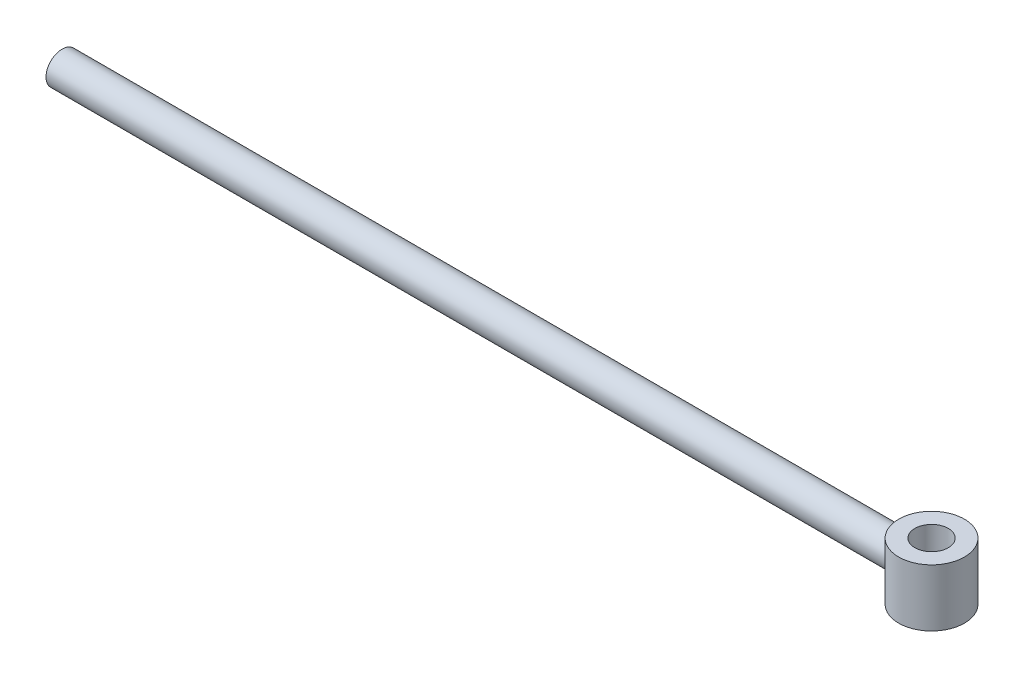
ISO-10303-21;
HEADER;
FILE_DESCRIPTION(('STEP AP214'),'2;1');
FILE_NAME('part.step','',(''),(''),'','','');
FILE_SCHEMA(('AUTOMOTIVE_DESIGN { 1 0 10303 214 1 1 1 1 }'));
ENDSEC;
DATA;
#1=APPLICATION_CONTEXT('core data for automotive mechanical design processes');
#2=APPLICATION_PROTOCOL_DEFINITION('international standard','automotive_design',2000,#1);
#3=PRODUCT_CONTEXT('',#1,'mechanical');
#4=PRODUCT('Part','Part','',(#3));
#5=PRODUCT_RELATED_PRODUCT_CATEGORY('part','',(#4));
#6=PRODUCT_DEFINITION_FORMATION('','',#4);
#7=PRODUCT_DEFINITION_CONTEXT('part definition',#1,'design');
#8=PRODUCT_DEFINITION('design','',#6,#7);
#9=PRODUCT_DEFINITION_SHAPE('','',#8);
#10=(LENGTH_UNIT() NAMED_UNIT(*) SI_UNIT(.MILLI.,.METRE.));
#11=(NAMED_UNIT(*) PLANE_ANGLE_UNIT() SI_UNIT($,.RADIAN.));
#12=(NAMED_UNIT(*) SI_UNIT($,.STERADIAN.) SOLID_ANGLE_UNIT());
#13=UNCERTAINTY_MEASURE_WITH_UNIT(LENGTH_MEASURE(1.E-05),#10,'distance_accuracy_value','');
#14=(GEOMETRIC_REPRESENTATION_CONTEXT(3) GLOBAL_UNCERTAINTY_ASSIGNED_CONTEXT((#13)) GLOBAL_UNIT_ASSIGNED_CONTEXT((#10,
#11,#12)) REPRESENTATION_CONTEXT('',''));
#15=CARTESIAN_POINT('',(0.,0.,0.));
#16=DIRECTION('',(0.,0.,1.));
#17=DIRECTION('',(1.,0.,0.));
#18=AXIS2_PLACEMENT_3D('',#15,#16,#17);
#19=CARTESIAN_POINT('',(38.1,60.96,-126.746));
#20=DIRECTION('',(0.,-1.,0.));
#21=DIRECTION('',(0.,0.,-1.));
#22=AXIS2_PLACEMENT_3D('',#19,#20,#21);
#23=PLANE('',#22);
#24=CARTESIAN_POINT('',(38.1,60.96,-139.7));
#25=DIRECTION('',(0.,1.,0.));
#26=DIRECTION('',(0.,0.,1.));
#27=AXIS2_PLACEMENT_3D('',#24,#25,#26);
#28=CIRCLE('',#27,6.604);
#29=CARTESIAN_POINT('',(38.1,60.96,-133.096));
#30=VERTEX_POINT('',#29);
#31=EDGE_CURVE('E10',#30,#30,#28,.T.);
#32=ORIENTED_EDGE('',*,*,#31,.F.);
#33=EDGE_LOOP('',(#32));
#34=FACE_BOUND('',#33,.T.);
#35=CARTESIAN_POINT('',(38.1,60.96,-139.7));
#36=DIRECTION('',(0.,1.,0.));
#37=DIRECTION('',(0.,0.,1.));
#38=AXIS2_PLACEMENT_3D('',#35,#36,#37);
#39=CIRCLE('',#38,12.954);
#40=CARTESIAN_POINT('',(38.1,60.96,-126.746));
#41=VERTEX_POINT('',#40);
#42=EDGE_CURVE('E45',#41,#41,#39,.T.);
#43=ORIENTED_EDGE('',*,*,#42,.T.);
#44=EDGE_LOOP('',(#43));
#45=FACE_BOUND('',#44,.T.);
#46=ADVANCED_FACE('F31',(#34,#45),#23,.F.);
#47=CARTESIAN_POINT('',(38.1,50.8,-139.7));
#48=DIRECTION('',(0.,1.,0.));
#49=DIRECTION('',(0.,0.,1.));
#50=AXIS2_PLACEMENT_3D('',#47,#48,#49);
#51=CYLINDRICAL_SURFACE('',#50,6.604);
#52=CARTESIAN_POINT('',(38.1,38.354,-139.7));
#53=DIRECTION('',(0.,1.,0.));
#54=DIRECTION('',(0.,0.,1.));
#55=AXIS2_PLACEMENT_3D('',#52,#53,#54);
#56=CIRCLE('',#55,6.604);
#57=CARTESIAN_POINT('',(38.1,38.354,-133.096));
#58=VERTEX_POINT('',#57);
#59=EDGE_CURVE('E37',#58,#58,#56,.T.);
#60=ORIENTED_EDGE('',*,*,#59,.F.);
#61=EDGE_LOOP('',(#60));
#62=FACE_BOUND('',#61,.T.);
#63=ORIENTED_EDGE('',*,*,#31,.T.);
#64=EDGE_LOOP('',(#63));
#65=FACE_BOUND('',#64,.T.);
#66=ADVANCED_FACE('F74',(#62,#65),#51,.F.);
#67=CARTESIAN_POINT('',(38.1,38.354,-126.746));
#68=DIRECTION('',(0.,1.,0.));
#69=DIRECTION('',(0.,0.,1.));
#70=AXIS2_PLACEMENT_3D('',#67,#68,#69);
#71=PLANE('',#70);
#72=CARTESIAN_POINT('',(38.1,38.354,-139.7));
#73=DIRECTION('',(0.,1.,0.));
#74=DIRECTION('',(0.,0.,1.));
#75=AXIS2_PLACEMENT_3D('',#72,#73,#74);
#76=CIRCLE('',#75,12.954);
#77=CARTESIAN_POINT('',(38.1,38.354,-126.746));
#78=VERTEX_POINT('',#77);
#79=EDGE_CURVE('E41',#78,#78,#76,.T.);
#80=ORIENTED_EDGE('',*,*,#79,.F.);
#81=EDGE_LOOP('',(#80));
#82=FACE_BOUND('',#81,.T.);
#83=ORIENTED_EDGE('',*,*,#59,.T.);
#84=EDGE_LOOP('',(#83));
#85=FACE_BOUND('',#84,.T.);
#86=ADVANCED_FACE('F79',(#82,#85),#71,.F.);
#87=CARTESIAN_POINT('',(38.1,50.8,-139.7));
#88=DIRECTION('',(0.,1.,0.));
#89=DIRECTION('',(0.,0.,1.));
#90=AXIS2_PLACEMENT_3D('',#87,#88,#89);
#91=CYLINDRICAL_SURFACE('',#90,12.954);
#92=CARTESIAN_POINT('',(26.8091357283864,50.165,-133.35));
#93=CARTESIAN_POINT('',(26.8091345194287,50.3310209709402,-133.350000943041));
#94=CARTESIAN_POINT('',(26.8054613740518,50.4970623056905,-133.356519782259));
#95=CARTESIAN_POINT('',(26.7909025321912,50.8278752109819,-133.382512665754));
#96=CARTESIAN_POINT('',(26.7800133015269,50.9926461192907,-133.401993058156));
#97=CARTESIAN_POINT('',(26.7514015930104,51.3198489655883,-133.453696944491));
#98=CARTESIAN_POINT('',(26.7336678897072,51.4822766040664,-133.485941374648));
#99=CARTESIAN_POINT('',(26.6919901669799,51.8034275344849,-133.562790955329));
#100=CARTESIAN_POINT('',(26.6680434598922,51.9621491907973,-133.607401455825));
#101=CARTESIAN_POINT('',(26.6148879861214,52.2739444918484,-133.708210555407));
#102=CARTESIAN_POINT('',(26.5857096439459,52.4270449318691,-133.764342411892));
#103=CARTESIAN_POINT('',(26.5228872978798,52.7277277276391,-133.887825072779));
#104=CARTESIAN_POINT('',(26.4892415703833,52.8753079252585,-133.955180209915));
#105=CARTESIAN_POINT('',(26.3830404234559,53.3085298750814,-134.173238421303));
#106=CARTESIAN_POINT('',(26.3051656681572,53.5849596242103,-134.340034476213));
#107=CARTESIAN_POINT('',(26.1365952187344,54.1287985128525,-134.726970185676));
#108=CARTESIAN_POINT('',(26.0453726322713,54.3937641716475,-134.950285902964));
#109=CARTESIAN_POINT('',(25.8645893505226,54.884502859345,-135.437582442392));
#110=CARTESIAN_POINT('',(25.7750294757531,55.1102569743632,-135.70158277373));
#111=CARTESIAN_POINT('',(25.6457891462847,55.4217486115604,-136.133016920814));
#112=CARTESIAN_POINT('',(25.6023564662654,55.523619587631,-136.287929806022));
#113=CARTESIAN_POINT('',(25.5196279516889,55.7138274796052,-136.606872386624));
#114=CARTESIAN_POINT('',(25.4803303632018,55.8021701409432,-136.770898171237));
#115=CARTESIAN_POINT('',(25.4070064920368,55.964457485692,-137.107005438899));
#116=CARTESIAN_POINT('',(25.3729790086762,56.0384054496212,-137.279085075379));
#117=CARTESIAN_POINT('',(25.3112012631133,56.1710975871901,-137.630101234286));
#118=CARTESIAN_POINT('',(25.2834503642544,56.2298433029357,-137.80903705911));
#119=CARTESIAN_POINT('',(25.2367553597481,56.3278866539171,-138.159813292571));
#120=CARTESIAN_POINT('',(25.217336602919,56.3682444779326,-138.331294528795));
#121=CARTESIAN_POINT('',(25.1852364970418,56.4346369318549,-138.677632628746));
#122=CARTESIAN_POINT('',(25.1725548645949,56.4606721642467,-138.852489350162));
#123=CARTESIAN_POINT('',(25.1543012648384,56.4980692509802,-139.204048600796));
#124=CARTESIAN_POINT('',(25.1487258309292,56.5094382599431,-139.38075018759));
#125=CARTESIAN_POINT('',(25.1448383607322,56.5173704844369,-139.734561018763));
#126=CARTESIAN_POINT('',(25.1465259024699,56.5139345601257,-139.911670238862));
#127=CARTESIAN_POINT('',(25.1566662708345,56.4932178504099,-140.249924074625));
#128=CARTESIAN_POINT('',(25.1645391316963,56.4771238159194,-140.4111604753));
#129=CARTESIAN_POINT('',(25.1861428946757,56.4327321332615,-140.731602933701));
#130=CARTESIAN_POINT('',(25.1998757864852,56.4044303400844,-140.890808282884));
#131=CARTESIAN_POINT('',(25.2328634550828,56.3359388320205,-141.205992973492));
#132=CARTESIAN_POINT('',(25.2521163247273,56.295753222823,-141.361973409197));
#133=CARTESIAN_POINT('',(25.2957021679788,56.2038791496866,-141.669837148275));
#134=CARTESIAN_POINT('',(25.3200370856554,56.1521862833,-141.821718858555));
#135=CARTESIAN_POINT('',(25.3736028512173,56.036984859735,-142.122515342152));
#136=CARTESIAN_POINT('',(25.4028966136967,55.9733231270601,-142.271360272638));
#137=CARTESIAN_POINT('',(25.4654814148901,55.835204988301,-142.563103116503));
#138=CARTESIAN_POINT('',(25.4987738992041,55.7607446763331,-142.705998853865));
#139=CARTESIAN_POINT('',(25.6035836718327,55.5219892562854,-143.124651908484));
#140=CARTESIAN_POINT('',(25.6800670252792,55.3422493657298,-143.390557089867));
#141=CARTESIAN_POINT('',(25.8472078263352,54.9280315861419,-143.913980204731));
#142=CARTESIAN_POINT('',(25.9385219088885,54.6900440008963,-144.168488764982));
#143=CARTESIAN_POINT('',(26.1205221013451,54.1752528247017,-144.635696893873));
#144=CARTESIAN_POINT('',(26.2112077158873,53.8984216182819,-144.848366456847));
#145=CARTESIAN_POINT('',(26.3420011019447,53.4496702802442,-145.137621463951));
#146=CARTESIAN_POINT('',(26.3858570732415,53.2895533322911,-145.231204425549));
#147=CARTESIAN_POINT('',(26.4692091613899,52.9608747376694,-145.404387748741));
#148=CARTESIAN_POINT('',(26.5087072382998,52.7923169374642,-145.483994406088));
#149=CARTESIAN_POINT('',(26.581892334402,52.4478688087468,-145.628395441464));
#150=CARTESIAN_POINT('',(26.6155826446418,52.2719827035493,-145.693198215125));
#151=CARTESIAN_POINT('',(26.675828450953,51.9140491418427,-145.807257082587));
#152=CARTESIAN_POINT('',(26.7023848795416,51.7320024941256,-145.856515208479));
#153=CARTESIAN_POINT('',(26.7454528186302,51.3776789569149,-145.935562421708));
#154=CARTESIAN_POINT('',(26.7625869321303,51.2057497121969,-145.966571742859));
#155=CARTESIAN_POINT('',(26.7891247961361,50.859328855553,-146.014346441624));
#156=CARTESIAN_POINT('',(26.7985289723583,50.6848373852772,-146.031112603663));
#157=CARTESIAN_POINT('',(26.80921085286,50.3349131592709,-146.05014302005));
#158=CARTESIAN_POINT('',(26.8104930493164,50.1594809775879,-146.052415290813));
#159=CARTESIAN_POINT('',(26.8048874312566,49.809167640272,-146.042442927349));
#160=CARTESIAN_POINT('',(26.7980001187757,49.6342864514415,-146.030199185165));
#161=CARTESIAN_POINT('',(26.7774722609599,49.3046336739581,-145.993398638389));
#162=CARTESIAN_POINT('',(26.7646044036311,49.1496540139324,-145.970247302639));
#163=CARTESIAN_POINT('',(26.7329587232138,48.8423605342224,-145.912694018571));
#164=CARTESIAN_POINT('',(26.7141789348035,48.6900476188525,-145.878288328783));
#165=CARTESIAN_POINT('',(26.6712963995991,48.3890953193555,-145.79859761045));
#166=CARTESIAN_POINT('',(26.6471944124057,48.2404554143675,-145.753314134335));
#167=CARTESIAN_POINT('',(26.5943564655263,47.9475737870794,-145.652271145477));
#168=CARTESIAN_POINT('',(26.5656187016505,47.8033338032719,-145.596507552595));
#169=CARTESIAN_POINT('',(26.5028742372998,47.5134640825603,-145.472162234246));
#170=CARTESIAN_POINT('',(26.4686859069385,47.3680759363509,-145.403108671536));
#171=CARTESIAN_POINT('',(26.3970138147125,47.0835649822582,-145.254550699828));
#172=CARTESIAN_POINT('',(26.3595289448654,46.9444443048425,-145.17504277259));
#173=CARTESIAN_POINT('',(26.2435409318805,46.5373786965788,-144.921590990735));
#174=CARTESIAN_POINT('',(26.1614775749279,46.2796121837325,-144.732668144432));
#175=CARTESIAN_POINT('',(25.9853086574986,45.7664631386068,-144.293756133767));
#176=CARTESIAN_POINT('',(25.8909412574546,45.5150912027726,-144.039156406326));
#177=CARTESIAN_POINT('',(25.7548646273288,45.1720316719533,-143.627440095094));
#178=CARTESIAN_POINT('',(25.7103891363287,45.0632811053582,-143.485122483034));
#179=CARTESIAN_POINT('',(25.6243895110163,44.8578395645913,-143.191224892051));
#180=CARTESIAN_POINT('',(25.5828641221261,44.7611434507064,-143.039648902024));
#181=CARTESIAN_POINT('',(25.5029361769318,44.5784713794439,-142.724426174196));
#182=CARTESIAN_POINT('',(25.4646284121339,44.4927961488066,-142.560580988121));
#183=CARTESIAN_POINT('',(25.3933427957471,44.3357274547047,-142.225144656105));
#184=CARTESIAN_POINT('',(25.3603625934758,44.2643276891474,-142.05355696938));
#185=CARTESIAN_POINT('',(25.3007021880871,44.1366007615901,-141.703879432793));
#186=CARTESIAN_POINT('',(25.2740191332753,44.0802667754313,-141.525792568468));
#187=CARTESIAN_POINT('',(25.2277602796869,43.983353263923,-141.164484420422));
#188=CARTESIAN_POINT('',(25.2081836783518,43.9427719595284,-140.981263719005));
#189=CARTESIAN_POINT('',(25.1781671656492,43.8808286326666,-140.627866141491));
#190=CARTESIAN_POINT('',(25.1670665827257,43.8580720787909,-140.45798861488));
#191=CARTESIAN_POINT('',(25.1515754853437,43.8263664706336,-140.116649882967));
#192=CARTESIAN_POINT('',(25.1471844857083,43.817416417989,-139.945188793075));
#193=CARTESIAN_POINT('',(25.1452342734918,43.8134378726006,-139.602114473153));
#194=CARTESIAN_POINT('',(25.1476732087432,43.8184056055792,-139.430501296984));
#195=CARTESIAN_POINT('',(25.1593112148401,43.8421906341595,-139.088471825116));
#196=CARTESIAN_POINT('',(25.1685101226314,43.8610075957102,-138.918055500649));
#197=CARTESIAN_POINT('',(25.192640184115,43.9106608295217,-138.590273313457));
#198=CARTESIAN_POINT('',(25.20718035921,43.9406791153059,-138.432753659823));
#199=CARTESIAN_POINT('',(25.2416444331066,44.0123842452525,-138.120943575924));
#200=CARTESIAN_POINT('',(25.261570052748,44.0540748192766,-137.966654194853));
#201=CARTESIAN_POINT('',(25.3063396556938,44.1487000771422,-137.662349744295));
#202=CARTESIAN_POINT('',(25.3311822999179,44.2016316999331,-137.512333523771));
#203=CARTESIAN_POINT('',(25.3852480339007,44.3182938324656,-137.217319478696));
#204=CARTESIAN_POINT('',(25.4144727986362,44.3820284726622,-137.072323599268));
#205=CARTESIAN_POINT('',(25.4780254618274,44.5227718557627,-136.781970070348));
#206=CARTESIAN_POINT('',(25.5125197213309,44.6002364405129,-136.636869503088));
#207=CARTESIAN_POINT('',(25.5848198318292,44.7657726116658,-136.353691947468));
#208=CARTESIAN_POINT('',(25.6226269017162,44.853848106679,-136.215617574064));
#209=CARTESIAN_POINT('',(25.7397955945507,45.1331351951527,-135.812913623685));
#210=CARTESIAN_POINT('',(25.8229380625024,45.339478904376,-135.559656660722));
#211=CARTESIAN_POINT('',(26.0002516971347,45.8092998533766,-135.065595949822));
#212=CARTESIAN_POINT('',(26.0947151766211,46.0763609620989,-134.828324216839));
#213=CARTESIAN_POINT('',(26.2772656401137,46.6483754834759,-134.400640147173));
#214=CARTESIAN_POINT('',(26.3653473078994,46.953359925732,-134.210266568179));
#215=CARTESIAN_POINT('',(26.4856346773667,47.4382194377993,-133.962283142037));
#216=CARTESIAN_POINT('',(26.5241788777058,47.6067885228694,-133.885137901634));
#217=CARTESIAN_POINT('',(26.5953590395799,47.9510771542138,-133.74554886185));
#218=CARTESIAN_POINT('',(26.627998034677,48.1267929719912,-133.683097509092));
#219=CARTESIAN_POINT('',(26.6859920530288,48.4836659419219,-133.573796863664));
#220=CARTESIAN_POINT('',(26.7113658976816,48.6648076660798,-133.526907205097));
#221=CARTESIAN_POINT('',(26.7538261044452,49.0313679770893,-133.4492057497));
#222=CARTESIAN_POINT('',(26.7709183398695,49.2167834349604,-133.418382557361));
#223=CARTESIAN_POINT('',(26.7919726404298,49.5295952690992,-133.38059182936));
#224=CARTESIAN_POINT('',(26.7983953164893,49.6563040903898,-133.369129414016));
#225=CARTESIAN_POINT('',(26.8069774589374,49.910337922273,-133.353832896412));
#226=CARTESIAN_POINT('',(26.8091366556493,50.0376629713331,-133.349999276693));
#227=CARTESIAN_POINT('',(26.8091357283864,50.165,-133.35));
#228=B_SPLINE_CURVE_WITH_KNOTS('',3,(#92,#93,#94,#95,#96,#97,#98,#99,#100,#101,#102,#103,#104,
#105,#106,#107,#108,#109,#110,#111,#112,#113,#114,#115,#116,#117,#118,#119,#120,#121,#122,#123,
#124,#125,#126,#127,#128,#129,#130,#131,#132,#133,#134,#135,#136,#137,#138,#139,#140,#141,#142,
#143,#144,#145,#146,#147,#148,#149,#150,#151,#152,#153,#154,#155,#156,#157,#158,#159,#160,#161,
#162,#163,#164,#165,#166,#167,#168,#169,#170,#171,#172,#173,#174,#175,#176,#177,#178,#179,#180,
#181,#182,#183,#184,#185,#186,#187,#188,#189,#190,#191,#192,#193,#194,#195,#196,#197,#198,#199,
#200,#201,#202,#203,#204,#205,#206,#207,#208,#209,#210,#211,#212,#213,#214,#215,#216,#217,#218,
#219,#220,#221,#222,#223,#224,#225,#226,#227),.UNSPECIFIED.,.T.,.F.,(4,2,2,2,2,2,2,2,2,2,2,2,2,
2,2,2,2,2,2,2,2,2,2,2,2,2,2,2,2,2,2,2,2,2,2,2,2,2,2,2,2,2,2,2,2,2,2,2,2,2,2,2,2,2,2,2,2,2,2,2,2,
2,2,2,2,2,2,4),(0.,0.497931272415873,0.996106594185176,1.49510245697003,1.99431453975243,
2.49071244196593,2.98730242388816,3.97951131388685,5.05021111333792,6.12142594454064,
6.69208421127271,7.2624994449807,7.83278452978109,8.40301174254048,8.93399577340326,
9.46495746651881,9.99566004261537,10.5263317856222,11.0124440762123,11.4987215509524,
11.9848312196324,12.4711271848038,12.9641323189184,13.4573162215208,14.4430963706711,
15.5193466155994,16.5963659232802,17.1674680049523,17.7383121647597,18.3088317772248,
18.8792767769456,19.40516240316,19.9310190649564,20.45658485586,20.9821183512004,
21.453262355852,21.9245631500612,22.3957967221725,22.867214137287,23.3603289526659,
23.8536101443399,24.839782659335,25.9444903688688,26.497614217114,27.0505014148379,
27.6162146281713,28.1816775458056,28.7468838972502,29.3120263979558,29.8266135972144,
30.3411635843733,30.8555740474378,31.3699721030498,31.8524611077339,32.3351044673562,
32.8176165664807,33.3003135684555,33.8039467673693,34.3077660539533,35.3149105914944,
36.4187820584604,37.5235627521292,38.0909494554941,38.6580438539611,39.2236555393851,
39.788865503978,40.1707514680738,40.5526615867215),.UNSPECIFIED.);
#229=CARTESIAN_POINT('',(26.8091357283864,50.165,-133.35));
#230=VERTEX_POINT('',#229);
#231=EDGE_CURVE('E50',#230,#230,#228,.T.);
#232=ORIENTED_EDGE('',*,*,#231,.F.);
#233=EDGE_LOOP('',(#232));
#234=FACE_BOUND('',#233,.T.);
#235=ORIENTED_EDGE('',*,*,#42,.F.);
#236=EDGE_LOOP('',(#235));
#237=FACE_BOUND('',#236,.T.);
#238=ORIENTED_EDGE('',*,*,#79,.T.);
#239=EDGE_LOOP('',(#238));
#240=FACE_BOUND('',#239,.T.);
#241=ADVANCED_FACE('F70',(#234,#237,#240),#91,.T.);
#242=CARTESIAN_POINT('',(51.055,50.165,-139.7));
#243=DIRECTION('',(-1.,0.,0.));
#244=DIRECTION('',(0.,0.,1.));
#245=AXIS2_PLACEMENT_3D('',#242,#243,#244);
#246=CYLINDRICAL_SURFACE('',#245,6.35);
#247=ORIENTED_EDGE('',*,*,#231,.T.);
#248=EDGE_LOOP('',(#247));
#249=FACE_BOUND('',#248,.T.);
#250=CARTESIAN_POINT('',(-304.8,50.165,-139.7));
#251=DIRECTION('',(-1.,0.,0.));
#252=DIRECTION('',(0.,0.,1.));
#253=AXIS2_PLACEMENT_3D('',#250,#251,#252);
#254=CIRCLE('',#253,6.35);
#255=CARTESIAN_POINT('',(-304.8,50.165,-133.35));
#256=VERTEX_POINT('',#255);
#257=EDGE_CURVE('E58',#256,#256,#254,.T.);
#258=ORIENTED_EDGE('',*,*,#257,.F.);
#259=EDGE_LOOP('',(#258));
#260=FACE_BOUND('',#259,.T.);
#261=ADVANCED_FACE('F59',(#249,#260),#246,.T.);
#262=CARTESIAN_POINT('',(-304.8,50.165,-139.7));
#263=DIRECTION('',(-1.,0.,0.));
#264=DIRECTION('',(0.,0.,1.));
#265=AXIS2_PLACEMENT_3D('',#262,#263,#264);
#266=PLANE('',#265);
#267=ORIENTED_EDGE('',*,*,#257,.T.);
#268=EDGE_LOOP('',(#267));
#269=FACE_BOUND('',#268,.T.);
#270=ADVANCED_FACE('F64',(#269),#266,.T.);
#271=CLOSED_SHELL('',(#46,#66,#86,#241,#261,#270));
#272=MANIFOLD_SOLID_BREP('B2',#271);
#273=ADVANCED_BREP_SHAPE_REPRESENTATION('',(#18,#272),#14);
#274=SHAPE_DEFINITION_REPRESENTATION(#9,#273);
ENDSEC;
END-ISO-10303-21;
